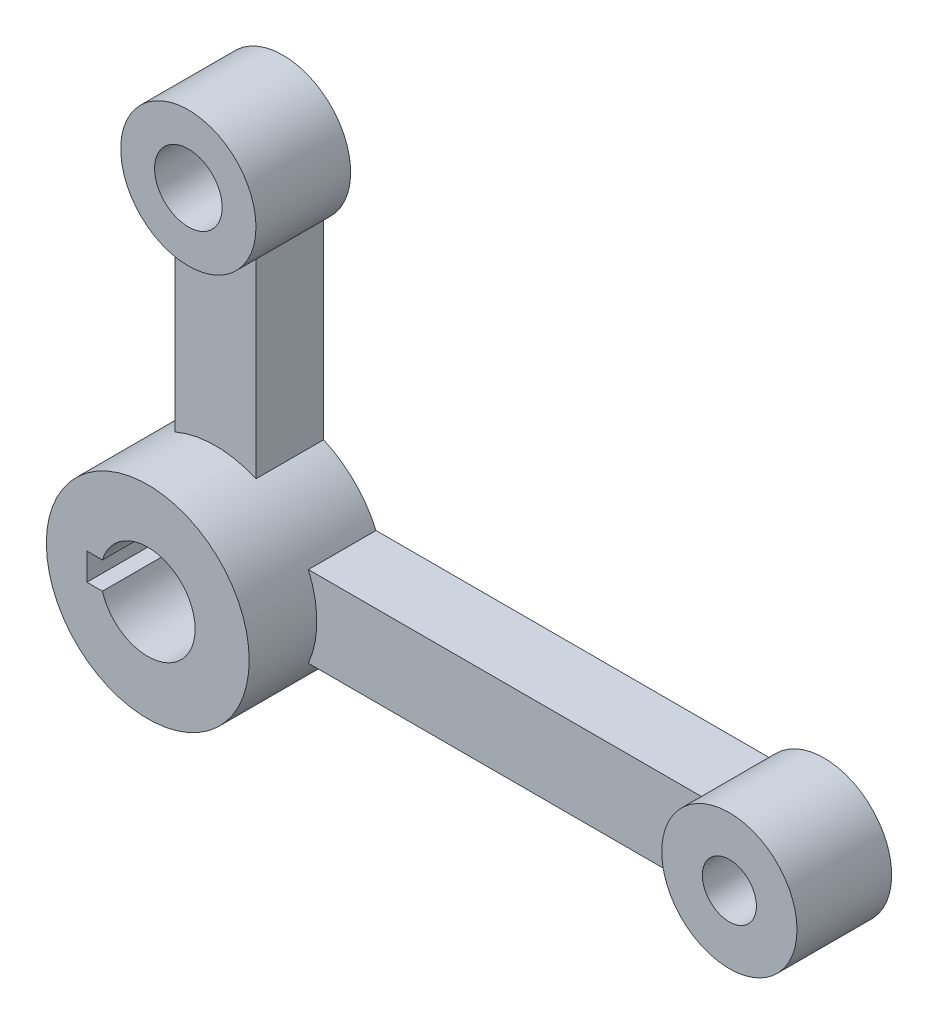
ISO-10303-21;
HEADER;
FILE_DESCRIPTION(('STEP AP214'),'2;1');
FILE_NAME('part.step','',(''),(''),'','','');
FILE_SCHEMA(('AUTOMOTIVE_DESIGN { 1 0 10303 214 1 1 1 1 }'));
ENDSEC;
DATA;
#1=APPLICATION_CONTEXT('core data for automotive mechanical design processes');
#2=APPLICATION_PROTOCOL_DEFINITION('international standard','automotive_design',2000,#1);
#3=PRODUCT_CONTEXT('',#1,'mechanical');
#4=PRODUCT('Part','Part','',(#3));
#5=PRODUCT_RELATED_PRODUCT_CATEGORY('part','',(#4));
#6=PRODUCT_DEFINITION_FORMATION('','',#4);
#7=PRODUCT_DEFINITION_CONTEXT('part definition',#1,'design');
#8=PRODUCT_DEFINITION('design','',#6,#7);
#9=PRODUCT_DEFINITION_SHAPE('','',#8);
#10=(LENGTH_UNIT() NAMED_UNIT(*) SI_UNIT(.MILLI.,.METRE.));
#11=(NAMED_UNIT(*) PLANE_ANGLE_UNIT() SI_UNIT($,.RADIAN.));
#12=(NAMED_UNIT(*) SI_UNIT($,.STERADIAN.) SOLID_ANGLE_UNIT());
#13=UNCERTAINTY_MEASURE_WITH_UNIT(LENGTH_MEASURE(1.E-05),#10,'distance_accuracy_value','');
#14=(GEOMETRIC_REPRESENTATION_CONTEXT(3) GLOBAL_UNCERTAINTY_ASSIGNED_CONTEXT((#13)) GLOBAL_UNIT_ASSIGNED_CONTEXT((#10,
#11,#12)) REPRESENTATION_CONTEXT('',''));
#15=CARTESIAN_POINT('',(0.,0.,0.));
#16=DIRECTION('',(0.,0.,1.));
#17=DIRECTION('',(1.,0.,0.));
#18=AXIS2_PLACEMENT_3D('',#15,#16,#17);
#19=CARTESIAN_POINT('',(80.,0.,-10.));
#20=DIRECTION('',(0.,0.,1.));
#21=DIRECTION('',(1.,0.,0.));
#22=AXIS2_PLACEMENT_3D('',#19,#20,#21);
#23=PLANE('',#22);
#24=DIRECTION('',(1.,0.,0.));
#25=VECTOR('',#24,1.);
#26=CARTESIAN_POINT('',(0.,-6.,-10.));
#27=LINE('',#26,#25);
#28=CARTESIAN_POINT('',(13.7477270848675,-6.,-10.));
#29=VERTEX_POINT('',#28);
#30=CARTESIAN_POINT('',(72.,-6.,-10.));
#31=VERTEX_POINT('',#30);
#32=EDGE_CURVE('E256',#29,#31,#27,.T.);
#33=ORIENTED_EDGE('',*,*,#32,.F.);
#34=CARTESIAN_POINT('',(0.,0.,-10.));
#35=DIRECTION('',(0.,0.,1.));
#36=DIRECTION('',(1.,0.,0.));
#37=AXIS2_PLACEMENT_3D('',#34,#35,#36);
#38=CIRCLE('',#37,15.);
#39=CARTESIAN_POINT('',(-6.,13.7477270848675,-10.));
#40=VERTEX_POINT('',#39);
#41=EDGE_CURVE('E242',#40,#29,#38,.T.);
#42=ORIENTED_EDGE('',*,*,#41,.F.);
#43=DIRECTION('',(0.,-1.,0.));
#44=VECTOR('',#43,1.);
#45=CARTESIAN_POINT('',(-6.,50.,-10.));
#46=LINE('',#45,#44);
#47=CARTESIAN_POINT('',(-6.,42.,-10.));
#48=VERTEX_POINT('',#47);
#49=EDGE_CURVE('E214',#48,#40,#46,.T.);
#50=ORIENTED_EDGE('',*,*,#49,.F.);
#51=CARTESIAN_POINT('',(0.,50.,-10.));
#52=DIRECTION('',(0.,0.,1.));
#53=DIRECTION('',(1.,0.,0.));
#54=AXIS2_PLACEMENT_3D('',#51,#52,#53);
#55=CIRCLE('',#54,10.);
#56=CARTESIAN_POINT('',(6.,42.,-10.));
#57=VERTEX_POINT('',#56);
#58=EDGE_CURVE('E206',#57,#48,#55,.T.);
#59=ORIENTED_EDGE('',*,*,#58,.F.);
#60=DIRECTION('',(0.,1.,0.));
#61=VECTOR('',#60,1.);
#62=CARTESIAN_POINT('',(6.,0.,-10.));
#63=LINE('',#62,#61);
#64=CARTESIAN_POINT('',(6.,13.7477270848675,-10.));
#65=VERTEX_POINT('',#64);
#66=EDGE_CURVE('E219',#65,#57,#63,.T.);
#67=ORIENTED_EDGE('',*,*,#66,.F.);
#68=CARTESIAN_POINT('',(13.7477270848675,6.,-10.));
#69=VERTEX_POINT('',#68);
#70=EDGE_CURVE('E236',#69,#65,#38,.T.);
#71=ORIENTED_EDGE('',*,*,#70,.F.);
#72=DIRECTION('',(-1.,0.,0.));
#73=VECTOR('',#72,1.);
#74=CARTESIAN_POINT('',(80.,6.,-10.));
#75=LINE('',#74,#73);
#76=CARTESIAN_POINT('',(72.,6.,-10.));
#77=VERTEX_POINT('',#76);
#78=EDGE_CURVE('E261',#77,#69,#75,.T.);
#79=ORIENTED_EDGE('',*,*,#78,.F.);
#80=CARTESIAN_POINT('',(80.,0.,-10.));
#81=DIRECTION('',(0.,0.,1.));
#82=DIRECTION('',(1.,0.,0.));
#83=AXIS2_PLACEMENT_3D('',#80,#81,#82);
#84=CIRCLE('',#83,9.99999999999999);
#85=EDGE_CURVE('E278',#31,#77,#84,.T.);
#86=ORIENTED_EDGE('',*,*,#85,.F.);
#87=EDGE_LOOP('',(#33,#42,#50,#59,#67,#71,#79,#86));
#88=FACE_BOUND('',#87,.T.);
#89=CARTESIAN_POINT('',(0.,50.,-10.));
#90=DIRECTION('',(0.,0.,1.));
#91=DIRECTION('',(1.,0.,0.));
#92=AXIS2_PLACEMENT_3D('',#89,#90,#91);
#93=CIRCLE('',#92,5.);
#94=CARTESIAN_POINT('',(5.,50.,-10.));
#95=VERTEX_POINT('',#94);
#96=EDGE_CURVE('E196',#95,#95,#93,.T.);
#97=ORIENTED_EDGE('',*,*,#96,.T.);
#98=EDGE_LOOP('',(#97));
#99=FACE_BOUND('',#98,.T.);
#100=CARTESIAN_POINT('',(80.,0.,-10.));
#101=DIRECTION('',(0.,0.,1.));
#102=DIRECTION('',(1.,0.,0.));
#103=AXIS2_PLACEMENT_3D('',#100,#101,#102);
#104=CIRCLE('',#103,4.);
#105=CARTESIAN_POINT('',(84.,0.,-10.));
#106=VERTEX_POINT('',#105);
#107=EDGE_CURVE('E185',#106,#106,#104,.T.);
#108=ORIENTED_EDGE('',*,*,#107,.T.);
#109=EDGE_LOOP('',(#108));
#110=FACE_BOUND('',#109,.T.);
#111=DIRECTION('',(1.,0.,0.));
#112=VECTOR('',#111,1.);
#113=CARTESIAN_POINT('',(-9.,-2.,-10.));
#114=LINE('',#113,#112);
#115=CARTESIAN_POINT('',(-9.,-2.,-10.));
#116=VERTEX_POINT('',#115);
#117=CARTESIAN_POINT('',(-6.70820393249937,-2.,-10.));
#118=VERTEX_POINT('',#117);
#119=EDGE_CURVE('E159',#116,#118,#114,.T.);
#120=ORIENTED_EDGE('',*,*,#119,.T.);
#121=CARTESIAN_POINT('',(0.,0.,-10.));
#122=DIRECTION('',(0.,0.,1.));
#123=DIRECTION('',(1.,0.,0.));
#124=AXIS2_PLACEMENT_3D('',#121,#122,#123);
#125=CIRCLE('',#124,7.);
#126=CARTESIAN_POINT('',(-6.70820393249937,2.,-10.));
#127=VERTEX_POINT('',#126);
#128=EDGE_CURVE('E161',#118,#127,#125,.T.);
#129=ORIENTED_EDGE('',*,*,#128,.T.);
#130=DIRECTION('',(-1.,0.,0.));
#131=VECTOR('',#130,1.);
#132=CARTESIAN_POINT('',(-6.,2.,-10.));
#133=LINE('',#132,#131);
#134=CARTESIAN_POINT('',(-9.,2.,-10.));
#135=VERTEX_POINT('',#134);
#136=EDGE_CURVE('E68',#127,#135,#133,.T.);
#137=ORIENTED_EDGE('',*,*,#136,.T.);
#138=DIRECTION('',(0.,-1.,0.));
#139=VECTOR('',#138,1.);
#140=CARTESIAN_POINT('',(-9.,2.,-10.));
#141=LINE('',#140,#139);
#142=EDGE_CURVE('E175',#135,#116,#141,.T.);
#143=ORIENTED_EDGE('',*,*,#142,.T.);
#144=EDGE_LOOP('',(#120,#129,#137,#143));
#145=FACE_BOUND('',#144,.T.);
#146=ADVANCED_FACE('F51',(#88,#99,#110,#145),#23,.F.);
#147=CARTESIAN_POINT('',(0.,0.,10.));
#148=DIRECTION('',(0.,0.,1.));
#149=DIRECTION('',(1.,0.,0.));
#150=AXIS2_PLACEMENT_3D('',#147,#148,#149);
#151=PLANE('',#150);
#152=CARTESIAN_POINT('',(0.,0.,10.));
#153=DIRECTION('',(0.,0.,1.));
#154=DIRECTION('',(1.,0.,0.));
#155=AXIS2_PLACEMENT_3D('',#152,#153,#154);
#156=CIRCLE('',#155,15.);
#157=CARTESIAN_POINT('',(15.,0.,10.));
#158=VERTEX_POINT('',#157);
#159=EDGE_CURVE('E237',#158,#158,#156,.T.);
#160=ORIENTED_EDGE('',*,*,#159,.T.);
#161=EDGE_LOOP('',(#160));
#162=FACE_BOUND('',#161,.T.);
#163=CARTESIAN_POINT('',(0.,0.,10.));
#164=DIRECTION('',(0.,0.,1.));
#165=DIRECTION('',(1.,0.,0.));
#166=AXIS2_PLACEMENT_3D('',#163,#164,#165);
#167=CIRCLE('',#166,7.);
#168=CARTESIAN_POINT('',(-6.70820393249937,-2.,10.));
#169=VERTEX_POINT('',#168);
#170=CARTESIAN_POINT('',(-6.70820393249937,2.,10.));
#171=VERTEX_POINT('',#170);
#172=EDGE_CURVE('E166',#169,#171,#167,.T.);
#173=ORIENTED_EDGE('',*,*,#172,.F.);
#174=DIRECTION('',(1.,0.,0.));
#175=VECTOR('',#174,1.);
#176=CARTESIAN_POINT('',(-9.,-2.,10.));
#177=LINE('',#176,#175);
#178=CARTESIAN_POINT('',(-9.,-2.,10.));
#179=VERTEX_POINT('',#178);
#180=EDGE_CURVE('E154',#179,#169,#177,.T.);
#181=ORIENTED_EDGE('',*,*,#180,.F.);
#182=DIRECTION('',(0.,-1.,0.));
#183=VECTOR('',#182,1.);
#184=CARTESIAN_POINT('',(-9.,2.,10.));
#185=LINE('',#184,#183);
#186=CARTESIAN_POINT('',(-9.,2.,10.));
#187=VERTEX_POINT('',#186);
#188=EDGE_CURVE('E143',#187,#179,#185,.T.);
#189=ORIENTED_EDGE('',*,*,#188,.F.);
#190=DIRECTION('',(-1.,0.,0.));
#191=VECTOR('',#190,1.);
#192=CARTESIAN_POINT('',(-6.,2.,10.));
#193=LINE('',#192,#191);
#194=EDGE_CURVE('E168',#171,#187,#193,.T.);
#195=ORIENTED_EDGE('',*,*,#194,.F.);
#196=EDGE_LOOP('',(#173,#181,#189,#195));
#197=FACE_BOUND('',#196,.T.);
#198=ADVANCED_FACE('F164',(#162,#197),#151,.T.);
#199=CARTESIAN_POINT('',(0.,0.,10.));
#200=DIRECTION('',(0.,0.,-1.));
#201=DIRECTION('',(-1.,0.,0.));
#202=AXIS2_PLACEMENT_3D('',#199,#200,#201);
#203=CYLINDRICAL_SURFACE('',#202,7.);
#204=ORIENTED_EDGE('',*,*,#128,.F.);
#205=DIRECTION('',(0.,0.,-1.));
#206=VECTOR('',#205,1.);
#207=CARTESIAN_POINT('',(-6.70820393249937,-2.,10.));
#208=LINE('',#207,#206);
#209=EDGE_CURVE('E11',#118,#169,#208,.F.);
#210=ORIENTED_EDGE('',*,*,#209,.T.);
#211=ORIENTED_EDGE('',*,*,#172,.T.);
#212=DIRECTION('',(0.,0.,-1.));
#213=VECTOR('',#212,1.);
#214=CARTESIAN_POINT('',(-6.70820393249937,2.,10.));
#215=LINE('',#214,#213);
#216=EDGE_CURVE('E61',#171,#127,#215,.T.);
#217=ORIENTED_EDGE('',*,*,#216,.T.);
#218=EDGE_LOOP('',(#204,#210,#211,#217));
#219=FACE_BOUND('',#218,.T.);
#220=ADVANCED_FACE('F297',(#219),#203,.F.);
#221=CARTESIAN_POINT('',(0.,-6.,0.));
#222=DIRECTION('',(0.,1.,0.));
#223=DIRECTION('',(0.,0.,1.));
#224=AXIS2_PLACEMENT_3D('',#221,#222,#223);
#225=PLANE('',#224);
#226=DIRECTION('',(0.,0.,-1.));
#227=VECTOR('',#226,1.);
#228=CARTESIAN_POINT('',(13.7477270848675,-6.,10.));
#229=LINE('',#228,#227);
#230=CARTESIAN_POINT('',(13.7477270848675,-6.,0.));
#231=VERTEX_POINT('',#230);
#232=EDGE_CURVE('E76',#29,#231,#229,.F.);
#233=ORIENTED_EDGE('',*,*,#232,.F.);
#234=ORIENTED_EDGE('',*,*,#32,.T.);
#235=DIRECTION('',(0.,0.,-1.));
#236=VECTOR('',#235,1.);
#237=CARTESIAN_POINT('',(72.,-6.,4.));
#238=LINE('',#237,#236);
#239=CARTESIAN_POINT('',(72.,-6.,0.));
#240=VERTEX_POINT('',#239);
#241=EDGE_CURVE('E274',#31,#240,#238,.F.);
#242=ORIENTED_EDGE('',*,*,#241,.T.);
#243=DIRECTION('',(1.,0.,0.));
#244=VECTOR('',#243,1.);
#245=CARTESIAN_POINT('',(0.,-6.,0.));
#246=LINE('',#245,#244);
#247=EDGE_CURVE('E257',#231,#240,#246,.T.);
#248=ORIENTED_EDGE('',*,*,#247,.F.);
#249=EDGE_LOOP('',(#233,#234,#242,#248));
#250=FACE_BOUND('',#249,.T.);
#251=ADVANCED_FACE('F318',(#250),#225,.F.);
#252=CARTESIAN_POINT('',(80.,6.,0.));
#253=DIRECTION('',(0.,-1.,0.));
#254=DIRECTION('',(0.,0.,-1.));
#255=AXIS2_PLACEMENT_3D('',#252,#253,#254);
#256=PLANE('',#255);
#257=DIRECTION('',(0.,0.,-1.));
#258=VECTOR('',#257,1.);
#259=CARTESIAN_POINT('',(13.7477270848675,6.,10.));
#260=LINE('',#259,#258);
#261=CARTESIAN_POINT('',(13.7477270848675,6.,0.));
#262=VERTEX_POINT('',#261);
#263=EDGE_CURVE('E251',#262,#69,#260,.T.);
#264=ORIENTED_EDGE('',*,*,#263,.F.);
#265=DIRECTION('',(-1.,0.,0.));
#266=VECTOR('',#265,1.);
#267=CARTESIAN_POINT('',(80.,6.,0.));
#268=LINE('',#267,#266);
#269=CARTESIAN_POINT('',(72.,6.,0.));
#270=VERTEX_POINT('',#269);
#271=EDGE_CURVE('E260',#270,#262,#268,.T.);
#272=ORIENTED_EDGE('',*,*,#271,.F.);
#273=DIRECTION('',(0.,0.,-1.));
#274=VECTOR('',#273,1.);
#275=CARTESIAN_POINT('',(72.,6.,4.));
#276=LINE('',#275,#274);
#277=EDGE_CURVE('E265',#270,#77,#276,.T.);
#278=ORIENTED_EDGE('',*,*,#277,.T.);
#279=ORIENTED_EDGE('',*,*,#78,.T.);
#280=EDGE_LOOP('',(#264,#272,#278,#279));
#281=FACE_BOUND('',#280,.T.);
#282=ADVANCED_FACE('F323',(#281),#256,.F.);
#283=CARTESIAN_POINT('',(80.,0.,4.));
#284=DIRECTION('',(0.,0.,-1.));
#285=DIRECTION('',(-1.,0.,0.));
#286=AXIS2_PLACEMENT_3D('',#283,#284,#285);
#287=CYLINDRICAL_SURFACE('',#286,9.99999999999999);
#288=CARTESIAN_POINT('',(80.,0.,4.));
#289=DIRECTION('',(0.,0.,1.));
#290=DIRECTION('',(1.,0.,0.));
#291=AXIS2_PLACEMENT_3D('',#288,#289,#290);
#292=CIRCLE('',#291,9.99999999999999);
#293=CARTESIAN_POINT('',(90.,0.,4.));
#294=VERTEX_POINT('',#293);
#295=EDGE_CURVE('E279',#294,#294,#292,.T.);
#296=ORIENTED_EDGE('',*,*,#295,.F.);
#297=EDGE_LOOP('',(#296));
#298=FACE_BOUND('',#297,.T.);
#299=ORIENTED_EDGE('',*,*,#241,.F.);
#300=ORIENTED_EDGE('',*,*,#85,.T.);
#301=ORIENTED_EDGE('',*,*,#277,.F.);
#302=CARTESIAN_POINT('',(80.,0.,0.));
#303=DIRECTION('',(0.,0.,1.));
#304=DIRECTION('',(1.,0.,0.));
#305=AXIS2_PLACEMENT_3D('',#302,#303,#304);
#306=CIRCLE('',#305,9.99999999999999);
#307=EDGE_CURVE('E283',#270,#240,#306,.T.);
#308=ORIENTED_EDGE('',*,*,#307,.T.);
#309=EDGE_LOOP('',(#299,#300,#301,#308));
#310=FACE_BOUND('',#309,.T.);
#311=ADVANCED_FACE('F54',(#298,#310),#287,.T.);
#312=CARTESIAN_POINT('',(80.,0.,4.));
#313=DIRECTION('',(0.,0.,1.));
#314=DIRECTION('',(1.,0.,0.));
#315=AXIS2_PLACEMENT_3D('',#312,#313,#314);
#316=PLANE('',#315);
#317=CARTESIAN_POINT('',(80.,0.,4.));
#318=DIRECTION('',(0.,0.,1.));
#319=DIRECTION('',(1.,0.,0.));
#320=AXIS2_PLACEMENT_3D('',#317,#318,#319);
#321=CIRCLE('',#320,4.);
#322=CARTESIAN_POINT('',(84.,0.,4.));
#323=VERTEX_POINT('',#322);
#324=EDGE_CURVE('E192',#323,#323,#321,.F.);
#325=ORIENTED_EDGE('',*,*,#324,.T.);
#326=EDGE_LOOP('',(#325));
#327=FACE_BOUND('',#326,.T.);
#328=ORIENTED_EDGE('',*,*,#295,.T.);
#329=EDGE_LOOP('',(#328));
#330=FACE_BOUND('',#329,.T.);
#331=ADVANCED_FACE('F311',(#327,#330),#316,.T.);
#332=CARTESIAN_POINT('',(0.,0.,0.));
#333=DIRECTION('',(0.,0.,1.));
#334=DIRECTION('',(1.,0.,0.));
#335=AXIS2_PLACEMENT_3D('',#332,#333,#334);
#336=PLANE('',#335);
#337=ORIENTED_EDGE('',*,*,#271,.T.);
#338=CARTESIAN_POINT('',(0.,0.,0.));
#339=DIRECTION('',(0.,0.,1.));
#340=DIRECTION('',(1.,0.,0.));
#341=AXIS2_PLACEMENT_3D('',#338,#339,#340);
#342=CIRCLE('',#341,15.);
#343=EDGE_CURVE('E289',#262,#231,#342,.F.);
#344=ORIENTED_EDGE('',*,*,#343,.T.);
#345=ORIENTED_EDGE('',*,*,#247,.T.);
#346=ORIENTED_EDGE('',*,*,#307,.F.);
#347=EDGE_LOOP('',(#337,#344,#345,#346));
#348=FACE_BOUND('',#347,.T.);
#349=ADVANCED_FACE('F315',(#348),#336,.T.);
#350=CARTESIAN_POINT('',(0.,0.,10.));
#351=DIRECTION('',(0.,0.,-1.));
#352=DIRECTION('',(-1.,0.,0.));
#353=AXIS2_PLACEMENT_3D('',#350,#351,#352);
#354=CYLINDRICAL_SURFACE('',#353,15.);
#355=ORIENTED_EDGE('',*,*,#159,.F.);
#356=EDGE_LOOP('',(#355));
#357=FACE_BOUND('',#356,.T.);
#358=ORIENTED_EDGE('',*,*,#41,.T.);
#359=ORIENTED_EDGE('',*,*,#232,.T.);
#360=ORIENTED_EDGE('',*,*,#343,.F.);
#361=ORIENTED_EDGE('',*,*,#263,.T.);
#362=ORIENTED_EDGE('',*,*,#70,.T.);
#363=DIRECTION('',(0.,0.,-1.));
#364=VECTOR('',#363,1.);
#365=CARTESIAN_POINT('',(6.,13.7477270848675,10.));
#366=LINE('',#365,#364);
#367=CARTESIAN_POINT('',(6.,13.7477270848675,0.));
#368=VERTEX_POINT('',#367);
#369=EDGE_CURVE('E223',#368,#65,#366,.T.);
#370=ORIENTED_EDGE('',*,*,#369,.F.);
#371=CARTESIAN_POINT('',(0.,0.,0.));
#372=DIRECTION('',(0.,0.,1.));
#373=DIRECTION('',(1.,0.,0.));
#374=AXIS2_PLACEMENT_3D('',#371,#372,#373);
#375=CIRCLE('',#374,15.);
#376=CARTESIAN_POINT('',(-6.,13.7477270848675,0.));
#377=VERTEX_POINT('',#376);
#378=EDGE_CURVE('E241',#368,#377,#375,.T.);
#379=ORIENTED_EDGE('',*,*,#378,.T.);
#380=DIRECTION('',(0.,0.,-1.));
#381=VECTOR('',#380,1.);
#382=CARTESIAN_POINT('',(-6.,13.7477270848675,10.));
#383=LINE('',#382,#381);
#384=EDGE_CURVE('E232',#40,#377,#383,.F.);
#385=ORIENTED_EDGE('',*,*,#384,.F.);
#386=EDGE_LOOP('',(#358,#359,#360,#361,#362,#370,#379,#385));
#387=FACE_BOUND('',#386,.T.);
#388=ADVANCED_FACE('F331',(#357,#387),#354,.T.);
#389=CARTESIAN_POINT('',(-6.,50.,0.));
#390=DIRECTION('',(1.,0.,0.));
#391=DIRECTION('',(0.,0.,-1.));
#392=AXIS2_PLACEMENT_3D('',#389,#390,#391);
#393=PLANE('',#392);
#394=DIRECTION('',(0.,0.,-1.));
#395=VECTOR('',#394,1.);
#396=CARTESIAN_POINT('',(-6.,42.,4.));
#397=LINE('',#396,#395);
#398=CARTESIAN_POINT('',(-6.,42.,0.));
#399=VERTEX_POINT('',#398);
#400=EDGE_CURVE('E211',#48,#399,#397,.F.);
#401=ORIENTED_EDGE('',*,*,#400,.F.);
#402=ORIENTED_EDGE('',*,*,#49,.T.);
#403=ORIENTED_EDGE('',*,*,#384,.T.);
#404=DIRECTION('',(0.,-1.,0.));
#405=VECTOR('',#404,1.);
#406=CARTESIAN_POINT('',(-6.,50.,0.));
#407=LINE('',#406,#405);
#408=EDGE_CURVE('E215',#399,#377,#407,.T.);
#409=ORIENTED_EDGE('',*,*,#408,.F.);
#410=EDGE_LOOP('',(#401,#402,#403,#409));
#411=FACE_BOUND('',#410,.T.);
#412=ADVANCED_FACE('F335',(#411),#393,.F.);
#413=CARTESIAN_POINT('',(6.,0.,0.));
#414=DIRECTION('',(-1.,0.,0.));
#415=DIRECTION('',(0.,0.,1.));
#416=AXIS2_PLACEMENT_3D('',#413,#414,#415);
#417=PLANE('',#416);
#418=DIRECTION('',(0.,0.,-1.));
#419=VECTOR('',#418,1.);
#420=CARTESIAN_POINT('',(6.,42.,4.));
#421=LINE('',#420,#419);
#422=CARTESIAN_POINT('',(6.,42.,0.));
#423=VERTEX_POINT('',#422);
#424=EDGE_CURVE('E205',#423,#57,#421,.T.);
#425=ORIENTED_EDGE('',*,*,#424,.F.);
#426=DIRECTION('',(0.,1.,0.));
#427=VECTOR('',#426,1.);
#428=CARTESIAN_POINT('',(6.,0.,0.));
#429=LINE('',#428,#427);
#430=EDGE_CURVE('E218',#368,#423,#429,.T.);
#431=ORIENTED_EDGE('',*,*,#430,.F.);
#432=ORIENTED_EDGE('',*,*,#369,.T.);
#433=ORIENTED_EDGE('',*,*,#66,.T.);
#434=EDGE_LOOP('',(#425,#431,#432,#433));
#435=FACE_BOUND('',#434,.T.);
#436=ADVANCED_FACE('F341',(#435),#417,.F.);
#437=CARTESIAN_POINT('',(0.,0.,0.));
#438=DIRECTION('',(0.,0.,1.));
#439=DIRECTION('',(1.,0.,0.));
#440=AXIS2_PLACEMENT_3D('',#437,#438,#439);
#441=PLANE('',#440);
#442=ORIENTED_EDGE('',*,*,#430,.T.);
#443=CARTESIAN_POINT('',(0.,50.,0.));
#444=DIRECTION('',(0.,0.,1.));
#445=DIRECTION('',(1.,0.,0.));
#446=AXIS2_PLACEMENT_3D('',#443,#444,#445);
#447=CIRCLE('',#446,10.);
#448=EDGE_CURVE('E247',#423,#399,#447,.F.);
#449=ORIENTED_EDGE('',*,*,#448,.T.);
#450=ORIENTED_EDGE('',*,*,#408,.T.);
#451=ORIENTED_EDGE('',*,*,#378,.F.);
#452=EDGE_LOOP('',(#442,#449,#450,#451));
#453=FACE_BOUND('',#452,.T.);
#454=ADVANCED_FACE('F346',(#453),#441,.T.);
#455=CARTESIAN_POINT('',(0.,50.,4.));
#456=DIRECTION('',(0.,0.,-1.));
#457=DIRECTION('',(-1.,0.,0.));
#458=AXIS2_PLACEMENT_3D('',#455,#456,#457);
#459=CYLINDRICAL_SURFACE('',#458,10.);
#460=CARTESIAN_POINT('',(0.,50.,4.));
#461=DIRECTION('',(0.,0.,1.));
#462=DIRECTION('',(1.,0.,0.));
#463=AXIS2_PLACEMENT_3D('',#460,#461,#462);
#464=CIRCLE('',#463,10.);
#465=CARTESIAN_POINT('',(10.,50.,4.));
#466=VERTEX_POINT('',#465);
#467=EDGE_CURVE('E201',#466,#466,#464,.T.);
#468=ORIENTED_EDGE('',*,*,#467,.F.);
#469=EDGE_LOOP('',(#468));
#470=FACE_BOUND('',#469,.T.);
#471=ORIENTED_EDGE('',*,*,#58,.T.);
#472=ORIENTED_EDGE('',*,*,#400,.T.);
#473=ORIENTED_EDGE('',*,*,#448,.F.);
#474=ORIENTED_EDGE('',*,*,#424,.T.);
#475=EDGE_LOOP('',(#471,#472,#473,#474));
#476=FACE_BOUND('',#475,.T.);
#477=ADVANCED_FACE('F351',(#470,#476),#459,.T.);
#478=CARTESIAN_POINT('',(0.,50.,4.));
#479=DIRECTION('',(0.,0.,1.));
#480=DIRECTION('',(1.,0.,0.));
#481=AXIS2_PLACEMENT_3D('',#478,#479,#480);
#482=PLANE('',#481);
#483=CARTESIAN_POINT('',(0.,50.,4.));
#484=DIRECTION('',(0.,0.,1.));
#485=DIRECTION('',(1.,0.,0.));
#486=AXIS2_PLACEMENT_3D('',#483,#484,#485);
#487=CIRCLE('',#486,5.);
#488=CARTESIAN_POINT('',(5.,50.,4.));
#489=VERTEX_POINT('',#488);
#490=EDGE_CURVE('E200',#489,#489,#487,.F.);
#491=ORIENTED_EDGE('',*,*,#490,.T.);
#492=EDGE_LOOP('',(#491));
#493=FACE_BOUND('',#492,.T.);
#494=ORIENTED_EDGE('',*,*,#467,.T.);
#495=EDGE_LOOP('',(#494));
#496=FACE_BOUND('',#495,.T.);
#497=ADVANCED_FACE('F356',(#493,#496),#482,.T.);
#498=CARTESIAN_POINT('',(0.,50.,10.));
#499=DIRECTION('',(0.,0.,-1.));
#500=DIRECTION('',(-1.,0.,0.));
#501=AXIS2_PLACEMENT_3D('',#498,#499,#500);
#502=CYLINDRICAL_SURFACE('',#501,5.);
#503=ORIENTED_EDGE('',*,*,#490,.F.);
#504=EDGE_LOOP('',(#503));
#505=FACE_BOUND('',#504,.T.);
#506=ORIENTED_EDGE('',*,*,#96,.F.);
#507=EDGE_LOOP('',(#506));
#508=FACE_BOUND('',#507,.T.);
#509=ADVANCED_FACE('F361',(#505,#508),#502,.F.);
#510=CARTESIAN_POINT('',(80.,0.,10.));
#511=DIRECTION('',(0.,0.,-1.));
#512=DIRECTION('',(-1.,0.,0.));
#513=AXIS2_PLACEMENT_3D('',#510,#511,#512);
#514=CYLINDRICAL_SURFACE('',#513,4.);
#515=ORIENTED_EDGE('',*,*,#324,.F.);
#516=EDGE_LOOP('',(#515));
#517=FACE_BOUND('',#516,.T.);
#518=ORIENTED_EDGE('',*,*,#107,.F.);
#519=EDGE_LOOP('',(#518));
#520=FACE_BOUND('',#519,.T.);
#521=ADVANCED_FACE('F366',(#517,#520),#514,.F.);
#522=CARTESIAN_POINT('',(-9.,2.,10.));
#523=DIRECTION('',(1.,0.,0.));
#524=DIRECTION('',(0.,0.,-1.));
#525=AXIS2_PLACEMENT_3D('',#522,#523,#524);
#526=PLANE('',#525);
#527=ORIENTED_EDGE('',*,*,#142,.F.);
#528=DIRECTION('',(0.,0.,-1.));
#529=VECTOR('',#528,1.);
#530=CARTESIAN_POINT('',(-9.,2.,10.));
#531=LINE('',#530,#529);
#532=EDGE_CURVE('E149',#187,#135,#531,.T.);
#533=ORIENTED_EDGE('',*,*,#532,.F.);
#534=ORIENTED_EDGE('',*,*,#188,.T.);
#535=DIRECTION('',(0.,0.,-1.));
#536=VECTOR('',#535,1.);
#537=CARTESIAN_POINT('',(-9.,-2.,10.));
#538=LINE('',#537,#536);
#539=EDGE_CURVE('E147',#179,#116,#538,.T.);
#540=ORIENTED_EDGE('',*,*,#539,.T.);
#541=EDGE_LOOP('',(#527,#533,#534,#540));
#542=FACE_BOUND('',#541,.T.);
#543=ADVANCED_FACE('F146',(#542),#526,.T.);
#544=CARTESIAN_POINT('',(-9.,-2.,10.));
#545=DIRECTION('',(0.,1.,0.));
#546=DIRECTION('',(0.,0.,1.));
#547=AXIS2_PLACEMENT_3D('',#544,#545,#546);
#548=PLANE('',#547);
#549=ORIENTED_EDGE('',*,*,#119,.F.);
#550=ORIENTED_EDGE('',*,*,#539,.F.);
#551=ORIENTED_EDGE('',*,*,#180,.T.);
#552=ORIENTED_EDGE('',*,*,#209,.F.);
#553=EDGE_LOOP('',(#549,#550,#551,#552));
#554=FACE_BOUND('',#553,.T.);
#555=ADVANCED_FACE('F157',(#554),#548,.T.);
#556=CARTESIAN_POINT('',(-6.,2.,10.));
#557=DIRECTION('',(0.,-1.,0.));
#558=DIRECTION('',(0.,0.,-1.));
#559=AXIS2_PLACEMENT_3D('',#556,#557,#558);
#560=PLANE('',#559);
#561=ORIENTED_EDGE('',*,*,#194,.T.);
#562=ORIENTED_EDGE('',*,*,#532,.T.);
#563=ORIENTED_EDGE('',*,*,#136,.F.);
#564=ORIENTED_EDGE('',*,*,#216,.F.);
#565=EDGE_LOOP('',(#561,#562,#563,#564));
#566=FACE_BOUND('',#565,.T.);
#567=ADVANCED_FACE('F380',(#566),#560,.T.);
#568=CLOSED_SHELL('',(#146,#198,#220,#251,#282,#311,#331,#349,#388,#412,#436,#454,#477,#497,
#509,#521,#543,#555,#567));
#569=MANIFOLD_SOLID_BREP('B2',#568);
#570=ADVANCED_BREP_SHAPE_REPRESENTATION('',(#18,#569),#14);
#571=SHAPE_DEFINITION_REPRESENTATION(#9,#570);
ENDSEC;
END-ISO-10303-21;
